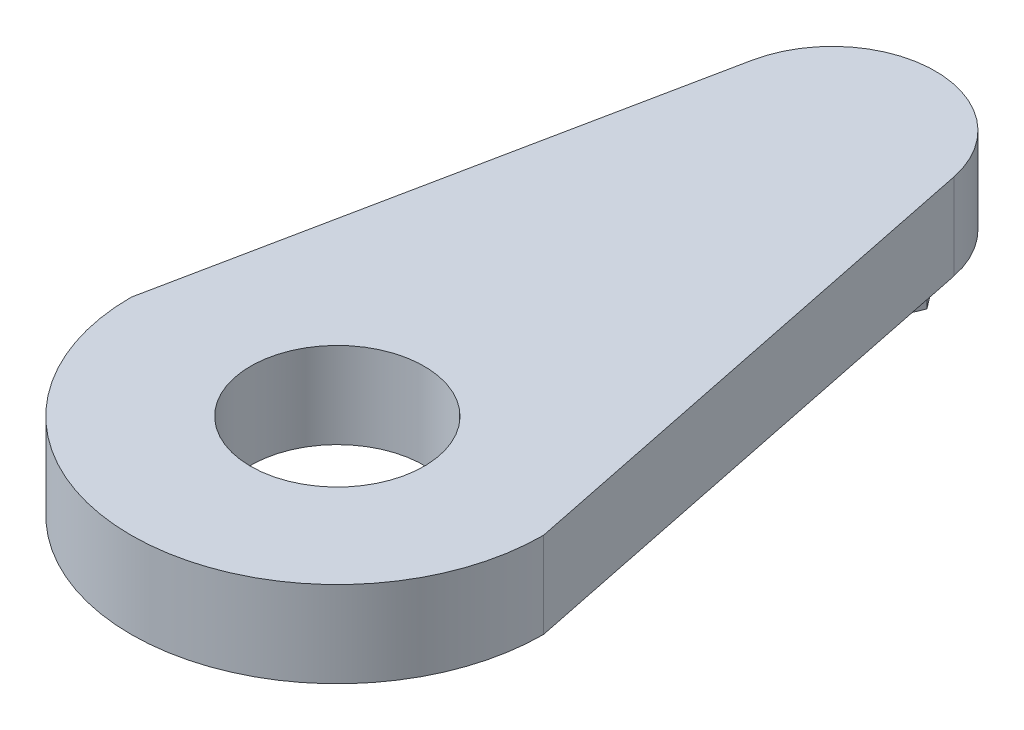
ISO-10303-21;
HEADER;
FILE_DESCRIPTION(('STEP AP214'),'2;1');
FILE_NAME('part.step','',(''),(''),'','','');
FILE_SCHEMA(('AUTOMOTIVE_DESIGN { 1 0 10303 214 1 1 1 1 }'));
ENDSEC;
DATA;
#1=APPLICATION_CONTEXT('core data for automotive mechanical design processes');
#2=APPLICATION_PROTOCOL_DEFINITION('international standard','automotive_design',2000,#1);
#3=PRODUCT_CONTEXT('',#1,'mechanical');
#4=PRODUCT('Part','Part','',(#3));
#5=PRODUCT_RELATED_PRODUCT_CATEGORY('part','',(#4));
#6=PRODUCT_DEFINITION_FORMATION('','',#4);
#7=PRODUCT_DEFINITION_CONTEXT('part definition',#1,'design');
#8=PRODUCT_DEFINITION('design','',#6,#7);
#9=PRODUCT_DEFINITION_SHAPE('','',#8);
#10=(LENGTH_UNIT() NAMED_UNIT(*) SI_UNIT(.MILLI.,.METRE.));
#11=(NAMED_UNIT(*) PLANE_ANGLE_UNIT() SI_UNIT($,.RADIAN.));
#12=(NAMED_UNIT(*) SI_UNIT($,.STERADIAN.) SOLID_ANGLE_UNIT());
#13=UNCERTAINTY_MEASURE_WITH_UNIT(LENGTH_MEASURE(1.E-05),#10,'distance_accuracy_value','');
#14=(GEOMETRIC_REPRESENTATION_CONTEXT(3) GLOBAL_UNCERTAINTY_ASSIGNED_CONTEXT((#13)) GLOBAL_UNIT_ASSIGNED_CONTEXT((#10,
#11,#12)) REPRESENTATION_CONTEXT('',''));
#15=CARTESIAN_POINT('',(0.,0.,0.));
#16=DIRECTION('',(0.,0.,1.));
#17=DIRECTION('',(1.,0.,0.));
#18=AXIS2_PLACEMENT_3D('',#15,#16,#17);
#19=CARTESIAN_POINT('',(0.,2.5,-14.4002445203407));
#20=DIRECTION('',(0.,-1.,0.));
#21=DIRECTION('',(0.,0.,-1.));
#22=AXIS2_PLACEMENT_3D('',#19,#20,#21);
#23=CYLINDRICAL_SURFACE('',#22,3.);
#24=CARTESIAN_POINT('',(0.,0.,-14.4002445203407));
#25=DIRECTION('',(0.,1.,0.));
#26=DIRECTION('',(0.,0.,1.));
#27=AXIS2_PLACEMENT_3D('',#24,#25,#26);
#28=CIRCLE('',#27,3.);
#29=CARTESIAN_POINT('',(-2.93943759325125,0.,-15.));
#30=VERTEX_POINT('',#29);
#31=CARTESIAN_POINT('',(2.93943759325125,0.,-15.));
#32=VERTEX_POINT('',#31);
#33=EDGE_CURVE('E192',#30,#32,#28,.F.);
#34=ORIENTED_EDGE('',*,*,#33,.F.);
#35=DIRECTION('',(0.,-1.,0.));
#36=VECTOR('',#35,1.);
#37=CARTESIAN_POINT('',(-2.93943759325125,2.5,-15.));
#38=LINE('',#37,#36);
#39=CARTESIAN_POINT('',(-2.93943759325125,2.5,-15.));
#40=VERTEX_POINT('',#39);
#41=EDGE_CURVE('E92',#40,#30,#38,.T.);
#42=ORIENTED_EDGE('',*,*,#41,.F.);
#43=CARTESIAN_POINT('',(0.,2.5,-14.4002445203407));
#44=DIRECTION('',(0.,1.,0.));
#45=DIRECTION('',(0.,0.,1.));
#46=AXIS2_PLACEMENT_3D('',#43,#44,#45);
#47=CIRCLE('',#46,3.);
#48=CARTESIAN_POINT('',(2.93943759325125,2.5,-15.));
#49=VERTEX_POINT('',#48);
#50=EDGE_CURVE('E203',#40,#49,#47,.F.);
#51=ORIENTED_EDGE('',*,*,#50,.T.);
#52=DIRECTION('',(0.,-1.,0.));
#53=VECTOR('',#52,1.);
#54=CARTESIAN_POINT('',(2.93943759325125,2.5,-15.));
#55=LINE('',#54,#53);
#56=EDGE_CURVE('E103',#49,#32,#55,.T.);
#57=ORIENTED_EDGE('',*,*,#56,.T.);
#58=EDGE_LOOP('',(#34,#42,#51,#57));
#59=FACE_BOUND('',#58,.T.);
#60=ADVANCED_FACE('F87',(#59),#23,.T.);
#61=CARTESIAN_POINT('',(-5.76019557641247,2.5,-1.17529586911256));
#62=DIRECTION('',(-0.97981253108375,0.,-0.199918493219751));
#63=DIRECTION('',(-0.199918493219751,0.,0.97981253108375));
#64=AXIS2_PLACEMENT_3D('',#61,#62,#63);
#65=PLANE('',#64);
#66=DIRECTION('',(0.199918493219751,0.,-0.97981253108375));
#67=VECTOR('',#66,1.);
#68=CARTESIAN_POINT('',(-5.76019557641247,0.,-1.17529586911256));
#69=LINE('',#68,#67);
#70=CARTESIAN_POINT('',(-6.,0.,0.));
#71=VERTEX_POINT('',#70);
#72=EDGE_CURVE('E214',#71,#30,#69,.T.);
#73=ORIENTED_EDGE('',*,*,#72,.F.);
#74=DIRECTION('',(0.,-1.,0.));
#75=VECTOR('',#74,1.);
#76=CARTESIAN_POINT('',(-6.,2.5,0.));
#77=LINE('',#76,#75);
#78=CARTESIAN_POINT('',(-6.,2.5,0.));
#79=VERTEX_POINT('',#78);
#80=EDGE_CURVE('E230',#79,#71,#77,.T.);
#81=ORIENTED_EDGE('',*,*,#80,.F.);
#82=DIRECTION('',(0.199918493219751,0.,-0.97981253108375));
#83=VECTOR('',#82,1.);
#84=CARTESIAN_POINT('',(-5.76019557641247,2.5,-1.17529586911256));
#85=LINE('',#84,#83);
#86=EDGE_CURVE('E201',#79,#40,#85,.T.);
#87=ORIENTED_EDGE('',*,*,#86,.T.);
#88=ORIENTED_EDGE('',*,*,#41,.T.);
#89=EDGE_LOOP('',(#73,#81,#87,#88));
#90=FACE_BOUND('',#89,.T.);
#91=ADVANCED_FACE('F228',(#90),#65,.T.);
#92=CARTESIAN_POINT('',(0.,2.5,0.));
#93=DIRECTION('',(0.,-1.,0.));
#94=DIRECTION('',(0.,0.,-1.));
#95=AXIS2_PLACEMENT_3D('',#92,#93,#94);
#96=CYLINDRICAL_SURFACE('',#95,6.);
#97=CARTESIAN_POINT('',(0.,0.,0.));
#98=DIRECTION('',(0.,1.,0.));
#99=DIRECTION('',(0.,0.,1.));
#100=AXIS2_PLACEMENT_3D('',#97,#98,#99);
#101=CIRCLE('',#100,6.);
#102=CARTESIAN_POINT('',(6.,0.,0.));
#103=VERTEX_POINT('',#102);
#104=EDGE_CURVE('E217',#71,#103,#101,.T.);
#105=ORIENTED_EDGE('',*,*,#104,.T.);
#106=DIRECTION('',(0.,-1.,0.));
#107=VECTOR('',#106,1.);
#108=CARTESIAN_POINT('',(6.,2.5,0.));
#109=LINE('',#108,#107);
#110=CARTESIAN_POINT('',(6.,2.5,0.));
#111=VERTEX_POINT('',#110);
#112=EDGE_CURVE('E116',#111,#103,#109,.T.);
#113=ORIENTED_EDGE('',*,*,#112,.F.);
#114=CARTESIAN_POINT('',(0.,2.5,0.));
#115=DIRECTION('',(0.,1.,0.));
#116=DIRECTION('',(0.,0.,1.));
#117=AXIS2_PLACEMENT_3D('',#114,#115,#116);
#118=CIRCLE('',#117,6.);
#119=EDGE_CURVE('E210',#79,#111,#118,.T.);
#120=ORIENTED_EDGE('',*,*,#119,.F.);
#121=ORIENTED_EDGE('',*,*,#80,.T.);
#122=EDGE_LOOP('',(#105,#113,#120,#121));
#123=FACE_BOUND('',#122,.T.);
#124=ADVANCED_FACE('F240',(#123),#96,.T.);
#125=CARTESIAN_POINT('',(5.76019557641247,2.5,-1.17529586911256));
#126=DIRECTION('',(0.97981253108375,0.,-0.199918493219751));
#127=DIRECTION('',(-0.199918493219751,0.,-0.97981253108375));
#128=AXIS2_PLACEMENT_3D('',#125,#126,#127);
#129=PLANE('',#128);
#130=DIRECTION('',(0.199918493219751,0.,0.97981253108375));
#131=VECTOR('',#130,1.);
#132=CARTESIAN_POINT('',(5.76019557641247,0.,-1.17529586911256));
#133=LINE('',#132,#131);
#134=EDGE_CURVE('E219',#32,#103,#133,.T.);
#135=ORIENTED_EDGE('',*,*,#134,.F.);
#136=ORIENTED_EDGE('',*,*,#56,.F.);
#137=DIRECTION('',(0.199918493219751,0.,0.97981253108375));
#138=VECTOR('',#137,1.);
#139=CARTESIAN_POINT('',(5.76019557641247,2.5,-1.17529586911256));
#140=LINE('',#139,#138);
#141=EDGE_CURVE('E207',#49,#111,#140,.T.);
#142=ORIENTED_EDGE('',*,*,#141,.T.);
#143=ORIENTED_EDGE('',*,*,#112,.T.);
#144=EDGE_LOOP('',(#135,#136,#142,#143));
#145=FACE_BOUND('',#144,.T.);
#146=ADVANCED_FACE('F244',(#145),#129,.T.);
#147=CARTESIAN_POINT('',(0.,2.5,0.));
#148=DIRECTION('',(0.,-1.,0.));
#149=DIRECTION('',(0.,0.,-1.));
#150=AXIS2_PLACEMENT_3D('',#147,#148,#149);
#151=CYLINDRICAL_SURFACE('',#150,2.525);
#152=CARTESIAN_POINT('',(0.,2.5,0.));
#153=DIRECTION('',(0.,1.,0.));
#154=DIRECTION('',(0.,0.,1.));
#155=AXIS2_PLACEMENT_3D('',#152,#153,#154);
#156=CIRCLE('',#155,2.525);
#157=CARTESIAN_POINT('',(0.,2.5,2.525));
#158=VERTEX_POINT('',#157);
#159=EDGE_CURVE('E211',#158,#158,#156,.T.);
#160=ORIENTED_EDGE('',*,*,#159,.T.);
#161=EDGE_LOOP('',(#160));
#162=FACE_BOUND('',#161,.T.);
#163=CARTESIAN_POINT('',(0.,0.,0.));
#164=DIRECTION('',(0.,1.,0.));
#165=DIRECTION('',(0.,0.,1.));
#166=AXIS2_PLACEMENT_3D('',#163,#164,#165);
#167=CIRCLE('',#166,2.525);
#168=CARTESIAN_POINT('',(0.,0.,2.525));
#169=VERTEX_POINT('',#168);
#170=EDGE_CURVE('E204',#169,#169,#167,.T.);
#171=ORIENTED_EDGE('',*,*,#170,.F.);
#172=EDGE_LOOP('',(#171));
#173=FACE_BOUND('',#172,.T.);
#174=ADVANCED_FACE('F243',(#162,#173),#151,.F.);
#175=CARTESIAN_POINT('',(0.,2.5,0.));
#176=DIRECTION('',(0.,1.,0.));
#177=DIRECTION('',(0.,0.,1.));
#178=AXIS2_PLACEMENT_3D('',#175,#176,#177);
#179=PLANE('',#178);
#180=ORIENTED_EDGE('',*,*,#50,.F.);
#181=ORIENTED_EDGE('',*,*,#86,.F.);
#182=ORIENTED_EDGE('',*,*,#119,.T.);
#183=ORIENTED_EDGE('',*,*,#141,.F.);
#184=EDGE_LOOP('',(#180,#181,#182,#183));
#185=FACE_BOUND('',#184,.T.);
#186=ORIENTED_EDGE('',*,*,#159,.F.);
#187=EDGE_LOOP('',(#186));
#188=FACE_BOUND('',#187,.T.);
#189=ADVANCED_FACE('F242',(#185,#188),#179,.T.);
#190=CARTESIAN_POINT('',(0.,0.,0.));
#191=DIRECTION('',(0.,1.,0.));
#192=DIRECTION('',(0.,0.,1.));
#193=AXIS2_PLACEMENT_3D('',#190,#191,#192);
#194=PLANE('',#193);
#195=CARTESIAN_POINT('',(0.,0.,-15.0390113085308));
#196=DIRECTION('',(0.,1.,0.));
#197=DIRECTION('',(0.,0.,1.));
#198=AXIS2_PLACEMENT_3D('',#195,#196,#197);
#199=CIRCLE('',#198,1.04059175163576);
#200=CARTESIAN_POINT('',(0.,0.,-13.998419556895));
#201=VERTEX_POINT('',#200);
#202=EDGE_CURVE('E12',#201,#201,#199,.F.);
#203=ORIENTED_EDGE('',*,*,#202,.F.);
#204=EDGE_LOOP('',(#203));
#205=FACE_BOUND('',#204,.T.);
#206=ORIENTED_EDGE('',*,*,#33,.T.);
#207=ORIENTED_EDGE('',*,*,#134,.T.);
#208=ORIENTED_EDGE('',*,*,#104,.F.);
#209=ORIENTED_EDGE('',*,*,#72,.T.);
#210=EDGE_LOOP('',(#206,#207,#208,#209));
#211=FACE_BOUND('',#210,.T.);
#212=ORIENTED_EDGE('',*,*,#170,.T.);
#213=EDGE_LOOP('',(#212));
#214=FACE_BOUND('',#213,.T.);
#215=ADVANCED_FACE('F233',(#205,#211,#214),#194,.F.);
#216=CARTESIAN_POINT('',(0.,-1.,-15.0390113085308));
#217=DIRECTION('',(0.,1.,0.));
#218=DIRECTION('',(0.,0.,1.));
#219=AXIS2_PLACEMENT_3D('',#216,#217,#218);
#220=CYLINDRICAL_SURFACE('',#219,1.04059175163576);
#221=CARTESIAN_POINT('',(0.,-1.,-15.0390113085308));
#222=DIRECTION('',(0.,-1.,0.));
#223=DIRECTION('',(0.,0.,-1.));
#224=AXIS2_PLACEMENT_3D('',#221,#222,#223);
#225=CIRCLE('',#224,1.04059175163576);
#226=CARTESIAN_POINT('',(0.,-1.,-16.0796030601666));
#227=VERTEX_POINT('',#226);
#228=EDGE_CURVE('E191',#227,#227,#225,.T.);
#229=ORIENTED_EDGE('',*,*,#228,.F.);
#230=EDGE_LOOP('',(#229));
#231=FACE_BOUND('',#230,.T.);
#232=ORIENTED_EDGE('',*,*,#202,.T.);
#233=EDGE_LOOP('',(#232));
#234=FACE_BOUND('',#233,.T.);
#235=ADVANCED_FACE('F291',(#231,#234),#220,.T.);
#236=CARTESIAN_POINT('',(1.87453596444857,-1.5,-15.2816207973373));
#237=DIRECTION('',(-0.923038703517801,0.,-0.384707098723402));
#238=DIRECTION('',(-0.384707098723402,0.,0.923038703517801));
#239=AXIS2_PLACEMENT_3D('',#236,#237,#238);
#240=PLANE('',#239);
#241=DIRECTION('',(-0.384707098723402,0.,0.923038703517801));
#242=VECTOR('',#241,1.);
#243=CARTESIAN_POINT('',(1.87453596444857,-1.,-15.2816207973373));
#244=LINE('',#243,#242);
#245=CARTESIAN_POINT('',(1.87453596444857,-1.,-15.2816207973373));
#246=VERTEX_POINT('',#245);
#247=CARTESIAN_POINT('',(1.14737396272988,-1.,-13.536920287414));
#248=VERTEX_POINT('',#247);
#249=EDGE_CURVE('E194',#246,#248,#244,.T.);
#250=ORIENTED_EDGE('',*,*,#249,.T.);
#251=DIRECTION('',(0.,1.,0.));
#252=VECTOR('',#251,1.);
#253=CARTESIAN_POINT('',(1.14737396272988,-1.5,-13.536920287414));
#254=LINE('',#253,#252);
#255=CARTESIAN_POINT('',(1.14737396272988,-1.5,-13.536920287414));
#256=VERTEX_POINT('',#255);
#257=EDGE_CURVE('E172',#256,#248,#254,.T.);
#258=ORIENTED_EDGE('',*,*,#257,.F.);
#259=DIRECTION('',(-0.384707098723402,0.,0.923038703517801));
#260=VECTOR('',#259,1.);
#261=CARTESIAN_POINT('',(1.87453596444857,-1.5,-15.2816207973373));
#262=LINE('',#261,#260);
#263=CARTESIAN_POINT('',(1.87453596444857,-1.5,-15.2816207973373));
#264=VERTEX_POINT('',#263);
#265=EDGE_CURVE('E177',#264,#256,#262,.T.);
#266=ORIENTED_EDGE('',*,*,#265,.F.);
#267=DIRECTION('',(0.,1.,0.));
#268=VECTOR('',#267,1.);
#269=CARTESIAN_POINT('',(1.87453596444857,-1.5,-15.2816207973373));
#270=LINE('',#269,#268);
#271=EDGE_CURVE('E397',#264,#246,#270,.T.);
#272=ORIENTED_EDGE('',*,*,#271,.T.);
#273=EDGE_LOOP('',(#250,#258,#266,#272));
#274=FACE_BOUND('',#273,.T.);
#275=ADVANCED_FACE('F186',(#274),#240,.F.);
#276=CARTESIAN_POINT('',(1.14737396272988,-1.5,-13.536920287414));
#277=DIRECTION('',(-0.128353231248226,0.,-0.991728515284369));
#278=DIRECTION('',(-0.991728515284369,0.,0.128353231248226));
#279=AXIS2_PLACEMENT_3D('',#276,#277,#278);
#280=PLANE('',#279);
#281=DIRECTION('',(-0.991728515284369,0.,0.128353231248226));
#282=VECTOR('',#281,1.);
#283=CARTESIAN_POINT('',(1.14737396272988,-1.,-13.536920287414));
#284=LINE('',#283,#282);
#285=CARTESIAN_POINT('',(-0.727162001718688,-1.,-13.2943107986075));
#286=VERTEX_POINT('',#285);
#287=EDGE_CURVE('E384',#248,#286,#284,.T.);
#288=ORIENTED_EDGE('',*,*,#287,.T.);
#289=DIRECTION('',(0.,1.,0.));
#290=VECTOR('',#289,1.);
#291=CARTESIAN_POINT('',(-0.727162001718688,-1.5,-13.2943107986075));
#292=LINE('',#291,#290);
#293=CARTESIAN_POINT('',(-0.727162001718688,-1.5,-13.2943107986075));
#294=VERTEX_POINT('',#293);
#295=EDGE_CURVE('E171',#294,#286,#292,.T.);
#296=ORIENTED_EDGE('',*,*,#295,.F.);
#297=DIRECTION('',(-0.991728515284369,0.,0.128353231248226));
#298=VECTOR('',#297,1.);
#299=CARTESIAN_POINT('',(1.14737396272988,-1.5,-13.536920287414));
#300=LINE('',#299,#298);
#301=EDGE_CURVE('E170',#256,#294,#300,.T.);
#302=ORIENTED_EDGE('',*,*,#301,.F.);
#303=ORIENTED_EDGE('',*,*,#257,.T.);
#304=EDGE_LOOP('',(#288,#296,#302,#303));
#305=FACE_BOUND('',#304,.T.);
#306=ADVANCED_FACE('F166',(#305),#280,.F.);
#307=CARTESIAN_POINT('',(-0.727162001718688,-1.5,-13.2943107986075));
#308=DIRECTION('',(0.794685472269575,0.,-0.607021416560967));
#309=DIRECTION('',(-0.607021416560967,0.,-0.794685472269575));
#310=AXIS2_PLACEMENT_3D('',#307,#308,#309);
#311=PLANE('',#310);
#312=DIRECTION('',(-0.607021416560967,0.,-0.794685472269575));
#313=VECTOR('',#312,1.);
#314=CARTESIAN_POINT('',(-0.727162001718688,-1.,-13.2943107986075));
#315=LINE('',#314,#313);
#316=CARTESIAN_POINT('',(-1.87453596444857,-1.,-14.7964018197243));
#317=VERTEX_POINT('',#316);
#318=EDGE_CURVE('E390',#286,#317,#315,.T.);
#319=ORIENTED_EDGE('',*,*,#318,.T.);
#320=DIRECTION('',(0.,1.,0.));
#321=VECTOR('',#320,1.);
#322=CARTESIAN_POINT('',(-1.87453596444857,-1.5,-14.7964018197243));
#323=LINE('',#322,#321);
#324=CARTESIAN_POINT('',(-1.87453596444857,-1.5,-14.7964018197243));
#325=VERTEX_POINT('',#324);
#326=EDGE_CURVE('E197',#325,#317,#323,.T.);
#327=ORIENTED_EDGE('',*,*,#326,.F.);
#328=DIRECTION('',(-0.607021416560967,0.,-0.794685472269575));
#329=VECTOR('',#328,1.);
#330=CARTESIAN_POINT('',(-0.727162001718688,-1.5,-13.2943107986075));
#331=LINE('',#330,#329);
#332=EDGE_CURVE('E180',#294,#325,#331,.T.);
#333=ORIENTED_EDGE('',*,*,#332,.F.);
#334=ORIENTED_EDGE('',*,*,#295,.T.);
#335=EDGE_LOOP('',(#319,#327,#333,#334));
#336=FACE_BOUND('',#335,.T.);
#337=ADVANCED_FACE('F319',(#336),#311,.F.);
#338=CARTESIAN_POINT('',(-1.87453596444857,-1.5,-14.7964018197243));
#339=DIRECTION('',(0.923038703517801,0.,0.384707098723403));
#340=DIRECTION('',(0.384707098723403,0.,-0.923038703517801));
#341=AXIS2_PLACEMENT_3D('',#338,#339,#340);
#342=PLANE('',#341);
#343=DIRECTION('',(0.384707098723403,0.,-0.923038703517801));
#344=VECTOR('',#343,1.);
#345=CARTESIAN_POINT('',(-1.87453596444857,-1.,-14.7964018197243));
#346=LINE('',#345,#344);
#347=CARTESIAN_POINT('',(-1.14737396272988,-1.,-16.5411023296476));
#348=VERTEX_POINT('',#347);
#349=EDGE_CURVE('E394',#317,#348,#346,.T.);
#350=ORIENTED_EDGE('',*,*,#349,.T.);
#351=DIRECTION('',(0.,1.,0.));
#352=VECTOR('',#351,1.);
#353=CARTESIAN_POINT('',(-1.14737396272988,-1.5,-16.5411023296476));
#354=LINE('',#353,#352);
#355=CARTESIAN_POINT('',(-1.14737396272988,-1.5,-16.5411023296476));
#356=VERTEX_POINT('',#355);
#357=EDGE_CURVE('E401',#356,#348,#354,.T.);
#358=ORIENTED_EDGE('',*,*,#357,.F.);
#359=DIRECTION('',(0.384707098723403,0.,-0.923038703517801));
#360=VECTOR('',#359,1.);
#361=CARTESIAN_POINT('',(-1.87453596444857,-1.5,-14.7964018197243));
#362=LINE('',#361,#360);
#363=EDGE_CURVE('E408',#325,#356,#362,.T.);
#364=ORIENTED_EDGE('',*,*,#363,.F.);
#365=ORIENTED_EDGE('',*,*,#326,.T.);
#366=EDGE_LOOP('',(#350,#358,#364,#365));
#367=FACE_BOUND('',#366,.T.);
#368=ADVANCED_FACE('F328',(#367),#342,.F.);
#369=CARTESIAN_POINT('',(-1.14737396272988,-1.5,-16.5411023296476));
#370=DIRECTION('',(0.128353231248227,0.,0.991728515284369));
#371=DIRECTION('',(0.991728515284369,0.,-0.128353231248227));
#372=AXIS2_PLACEMENT_3D('',#369,#370,#371);
#373=PLANE('',#372);
#374=DIRECTION('',(0.991728515284369,0.,-0.128353231248227));
#375=VECTOR('',#374,1.);
#376=CARTESIAN_POINT('',(-1.14737396272988,-1.,-16.5411023296476));
#377=LINE('',#376,#375);
#378=CARTESIAN_POINT('',(0.727162001718686,-1.,-16.7837118184541));
#379=VERTEX_POINT('',#378);
#380=EDGE_CURVE('E393',#348,#379,#377,.T.);
#381=ORIENTED_EDGE('',*,*,#380,.T.);
#382=DIRECTION('',(0.,1.,0.));
#383=VECTOR('',#382,1.);
#384=CARTESIAN_POINT('',(0.727162001718686,-1.5,-16.7837118184541));
#385=LINE('',#384,#383);
#386=CARTESIAN_POINT('',(0.727162001718686,-1.5,-16.7837118184541));
#387=VERTEX_POINT('',#386);
#388=EDGE_CURVE('E399',#387,#379,#385,.T.);
#389=ORIENTED_EDGE('',*,*,#388,.F.);
#390=DIRECTION('',(0.991728515284369,0.,-0.128353231248227));
#391=VECTOR('',#390,1.);
#392=CARTESIAN_POINT('',(-1.14737396272988,-1.5,-16.5411023296476));
#393=LINE('',#392,#391);
#394=EDGE_CURVE('E415',#356,#387,#393,.T.);
#395=ORIENTED_EDGE('',*,*,#394,.F.);
#396=ORIENTED_EDGE('',*,*,#357,.T.);
#397=EDGE_LOOP('',(#381,#389,#395,#396));
#398=FACE_BOUND('',#397,.T.);
#399=ADVANCED_FACE('F336',(#398),#373,.F.);
#400=CARTESIAN_POINT('',(0.727162001718686,-1.5,-16.7837118184541));
#401=DIRECTION('',(-0.794685472269575,0.,0.607021416560967));
#402=DIRECTION('',(0.607021416560967,0.,0.794685472269575));
#403=AXIS2_PLACEMENT_3D('',#400,#401,#402);
#404=PLANE('',#403);
#405=DIRECTION('',(0.607021416560967,0.,0.794685472269575));
#406=VECTOR('',#405,1.);
#407=CARTESIAN_POINT('',(0.727162001718686,-1.,-16.7837118184541));
#408=LINE('',#407,#406);
#409=EDGE_CURVE('E190',#379,#246,#408,.T.);
#410=ORIENTED_EDGE('',*,*,#409,.T.);
#411=ORIENTED_EDGE('',*,*,#271,.F.);
#412=DIRECTION('',(0.607021416560967,0.,0.794685472269575));
#413=VECTOR('',#412,1.);
#414=CARTESIAN_POINT('',(0.727162001718686,-1.5,-16.7837118184541));
#415=LINE('',#414,#413);
#416=EDGE_CURVE('E181',#387,#264,#415,.T.);
#417=ORIENTED_EDGE('',*,*,#416,.F.);
#418=ORIENTED_EDGE('',*,*,#388,.T.);
#419=EDGE_LOOP('',(#410,#411,#417,#418));
#420=FACE_BOUND('',#419,.T.);
#421=ADVANCED_FACE('F349',(#420),#404,.F.);
#422=CARTESIAN_POINT('',(0.,-1.5,0.));
#423=DIRECTION('',(0.,-1.,0.));
#424=DIRECTION('',(0.,0.,-1.));
#425=AXIS2_PLACEMENT_3D('',#422,#423,#424);
#426=PLANE('',#425);
#427=ORIENTED_EDGE('',*,*,#265,.T.);
#428=ORIENTED_EDGE('',*,*,#301,.T.);
#429=ORIENTED_EDGE('',*,*,#332,.T.);
#430=ORIENTED_EDGE('',*,*,#363,.T.);
#431=ORIENTED_EDGE('',*,*,#394,.T.);
#432=ORIENTED_EDGE('',*,*,#416,.T.);
#433=EDGE_LOOP('',(#427,#428,#429,#430,#431,#432));
#434=FACE_BOUND('',#433,.T.);
#435=ADVANCED_FACE('F182',(#434),#426,.T.);
#436=CARTESIAN_POINT('',(0.,-1.,0.));
#437=DIRECTION('',(0.,-1.,0.));
#438=DIRECTION('',(0.,0.,-1.));
#439=AXIS2_PLACEMENT_3D('',#436,#437,#438);
#440=PLANE('',#439);
#441=ORIENTED_EDGE('',*,*,#228,.T.);
#442=EDGE_LOOP('',(#441));
#443=FACE_BOUND('',#442,.T.);
#444=ORIENTED_EDGE('',*,*,#249,.F.);
#445=ORIENTED_EDGE('',*,*,#409,.F.);
#446=ORIENTED_EDGE('',*,*,#380,.F.);
#447=ORIENTED_EDGE('',*,*,#349,.F.);
#448=ORIENTED_EDGE('',*,*,#318,.F.);
#449=ORIENTED_EDGE('',*,*,#287,.F.);
#450=EDGE_LOOP('',(#444,#445,#446,#447,#448,#449));
#451=FACE_BOUND('',#450,.T.);
#452=ADVANCED_FACE('F366',(#443,#451),#440,.F.);
#453=CLOSED_SHELL('',(#60,#91,#124,#146,#174,#189,#215,#235,#275,#306,#337,#368,#399,#421,#435,#452));
#454=MANIFOLD_SOLID_BREP('B2',#453);
#455=ADVANCED_BREP_SHAPE_REPRESENTATION('',(#18,#454),#14);
#456=SHAPE_DEFINITION_REPRESENTATION(#9,#455);
ENDSEC;
END-ISO-10303-21;
